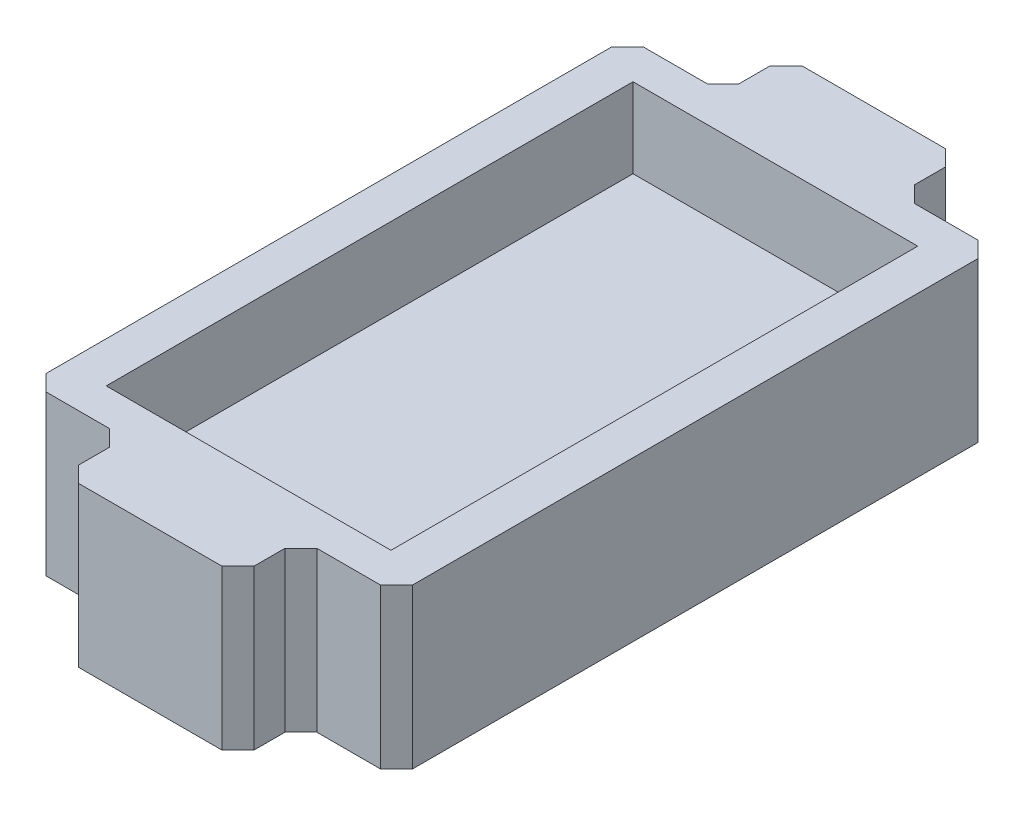
ISO-10303-21;
HEADER;
FILE_DESCRIPTION(('STEP AP214'),'2;1');
FILE_NAME('part.step','',(''),(''),'','','');
FILE_SCHEMA(('AUTOMOTIVE_DESIGN { 1 0 10303 214 1 1 1 1 }'));
ENDSEC;
DATA;
#1=APPLICATION_CONTEXT('core data for automotive mechanical design processes');
#2=APPLICATION_PROTOCOL_DEFINITION('international standard','automotive_design',2000,#1);
#3=PRODUCT_CONTEXT('',#1,'mechanical');
#4=PRODUCT('Part','Part','',(#3));
#5=PRODUCT_RELATED_PRODUCT_CATEGORY('part','',(#4));
#6=PRODUCT_DEFINITION_FORMATION('','',#4);
#7=PRODUCT_DEFINITION_CONTEXT('part definition',#1,'design');
#8=PRODUCT_DEFINITION('design','',#6,#7);
#9=PRODUCT_DEFINITION_SHAPE('','',#8);
#10=(LENGTH_UNIT() NAMED_UNIT(*) SI_UNIT(.MILLI.,.METRE.));
#11=(NAMED_UNIT(*) PLANE_ANGLE_UNIT() SI_UNIT($,.RADIAN.));
#12=(NAMED_UNIT(*) SI_UNIT($,.STERADIAN.) SOLID_ANGLE_UNIT());
#13=UNCERTAINTY_MEASURE_WITH_UNIT(LENGTH_MEASURE(1.E-05),#10,'distance_accuracy_value','');
#14=(GEOMETRIC_REPRESENTATION_CONTEXT(3) GLOBAL_UNCERTAINTY_ASSIGNED_CONTEXT((#13)) GLOBAL_UNIT_ASSIGNED_CONTEXT((#10,
#11,#12)) REPRESENTATION_CONTEXT('',''));
#15=CARTESIAN_POINT('',(0.,0.,0.));
#16=DIRECTION('',(0.,0.,1.));
#17=DIRECTION('',(1.,0.,0.));
#18=AXIS2_PLACEMENT_3D('',#15,#16,#17);
#19=CARTESIAN_POINT('',(0.,10.,0.));
#20=DIRECTION('',(0.,1.,0.));
#21=DIRECTION('',(0.,0.,1.));
#22=AXIS2_PLACEMENT_3D('',#19,#20,#21);
#23=PLANE('',#22);
#24=DIRECTION('',(1.,0.,0.));
#25=VECTOR('',#24,1.);
#26=CARTESIAN_POINT('',(0.,10.,0.));
#27=LINE('',#26,#25);
#28=CARTESIAN_POINT('',(18.,10.,0.));
#29=VERTEX_POINT('',#28);
#30=CARTESIAN_POINT('',(22.,10.,0.));
#31=VERTEX_POINT('',#30);
#32=EDGE_CURVE('E267',#29,#31,#27,.T.);
#33=ORIENTED_EDGE('',*,*,#32,.T.);
#34=DIRECTION('',(-0.707106781186548,0.,0.707106781186548));
#35=VECTOR('',#34,1.);
#36=CARTESIAN_POINT('',(11.,10.,11.));
#37=LINE('',#36,#35);
#38=CARTESIAN_POINT('',(23.,10.,-1.));
#39=VERTEX_POINT('',#38);
#40=EDGE_CURVE('E361',#31,#39,#37,.F.);
#41=ORIENTED_EDGE('',*,*,#40,.T.);
#42=DIRECTION('',(0.,0.,-1.));
#43=VECTOR('',#42,1.);
#44=CARTESIAN_POINT('',(23.,10.,0.));
#45=LINE('',#44,#43);
#46=CARTESIAN_POINT('',(23.,10.,-36.5));
#47=VERTEX_POINT('',#46);
#48=EDGE_CURVE('E272',#39,#47,#45,.T.);
#49=ORIENTED_EDGE('',*,*,#48,.T.);
#50=DIRECTION('',(0.70710678118655,0.,0.707106781186545));
#51=VECTOR('',#50,1.);
#52=CARTESIAN_POINT('',(29.7499999999999,10.,-29.7500000000001));
#53=LINE('',#52,#51);
#54=CARTESIAN_POINT('',(22.,10.,-37.5));
#55=VERTEX_POINT('',#54);
#56=EDGE_CURVE('E347',#47,#55,#53,.F.);
#57=ORIENTED_EDGE('',*,*,#56,.T.);
#58=DIRECTION('',(-1.,0.,0.));
#59=VECTOR('',#58,1.);
#60=CARTESIAN_POINT('',(0.,10.,-37.5));
#61=LINE('',#60,#59);
#62=CARTESIAN_POINT('',(18.,10.,-37.5));
#63=VERTEX_POINT('',#62);
#64=EDGE_CURVE('E275',#55,#63,#61,.T.);
#65=ORIENTED_EDGE('',*,*,#64,.T.);
#66=DIRECTION('',(-0.707106781186545,0.,-0.70710678118655));
#67=VECTOR('',#66,1.);
#68=CARTESIAN_POINT('',(17.,10.,-38.5));
#69=LINE('',#68,#67);
#70=CARTESIAN_POINT('',(17.,10.,-38.5));
#71=VERTEX_POINT('',#70);
#72=EDGE_CURVE('E11',#63,#71,#69,.T.);
#73=ORIENTED_EDGE('',*,*,#72,.T.);
#74=DIRECTION('',(0.,0.,1.));
#75=VECTOR('',#74,1.);
#76=CARTESIAN_POINT('',(17.,10.,0.));
#77=LINE('',#76,#75);
#78=CARTESIAN_POINT('',(17.,10.,-40.45));
#79=VERTEX_POINT('',#78);
#80=EDGE_CURVE('E280',#79,#71,#77,.T.);
#81=ORIENTED_EDGE('',*,*,#80,.F.);
#82=DIRECTION('',(0.70710678118655,0.,0.707106781186545));
#83=VECTOR('',#82,1.);
#84=CARTESIAN_POINT('',(28.7249999999999,10.,-28.7250000000001));
#85=LINE('',#84,#83);
#86=CARTESIAN_POINT('',(16.,10.,-41.45));
#87=VERTEX_POINT('',#86);
#88=EDGE_CURVE('E349',#79,#87,#85,.F.);
#89=ORIENTED_EDGE('',*,*,#88,.T.);
#90=DIRECTION('',(1.,0.,0.));
#91=VECTOR('',#90,1.);
#92=CARTESIAN_POINT('',(0.,10.,-41.45));
#93=LINE('',#92,#91);
#94=CARTESIAN_POINT('',(7.00000000000001,10.,-41.45));
#95=VERTEX_POINT('',#94);
#96=EDGE_CURVE('E283',#95,#87,#93,.T.);
#97=ORIENTED_EDGE('',*,*,#96,.F.);
#98=DIRECTION('',(-0.707106781186548,0.,0.707106781186548));
#99=VECTOR('',#98,1.);
#100=CARTESIAN_POINT('',(-17.225,10.,-17.225));
#101=LINE('',#100,#99);
#102=CARTESIAN_POINT('',(6.,10.,-40.45));
#103=VERTEX_POINT('',#102);
#104=EDGE_CURVE('E351',#95,#103,#101,.T.);
#105=ORIENTED_EDGE('',*,*,#104,.T.);
#106=DIRECTION('',(0.,0.,1.));
#107=VECTOR('',#106,1.);
#108=CARTESIAN_POINT('',(5.99999999999999,10.,0.));
#109=LINE('',#108,#107);
#110=CARTESIAN_POINT('',(6.,10.,-38.5));
#111=VERTEX_POINT('',#110);
#112=EDGE_CURVE('E279',#103,#111,#109,.T.);
#113=ORIENTED_EDGE('',*,*,#112,.T.);
#114=DIRECTION('',(0.707106781186545,0.,-0.70710678118655));
#115=VECTOR('',#114,1.);
#116=CARTESIAN_POINT('',(5.00000000000002,10.,-37.5));
#117=LINE('',#116,#115);
#118=CARTESIAN_POINT('',(5.00000000000002,10.,-37.5));
#119=VERTEX_POINT('',#118);
#120=EDGE_CURVE('E422',#111,#119,#117,.F.);
#121=ORIENTED_EDGE('',*,*,#120,.T.);
#122=CARTESIAN_POINT('',(1.00000000000001,10.,-37.5));
#123=VERTEX_POINT('',#122);
#124=EDGE_CURVE('E276',#119,#123,#61,.T.);
#125=ORIENTED_EDGE('',*,*,#124,.T.);
#126=DIRECTION('',(0.707106781186548,0.,-0.707106781186548));
#127=VECTOR('',#126,1.);
#128=CARTESIAN_POINT('',(-18.25,10.,-18.25));
#129=LINE('',#128,#127);
#130=CARTESIAN_POINT('',(0.,10.,-36.5));
#131=VERTEX_POINT('',#130);
#132=EDGE_CURVE('E353',#123,#131,#129,.F.);
#133=ORIENTED_EDGE('',*,*,#132,.T.);
#134=DIRECTION('',(0.,0.,1.));
#135=VECTOR('',#134,1.);
#136=CARTESIAN_POINT('',(0.,10.,0.));
#137=LINE('',#136,#135);
#138=CARTESIAN_POINT('',(0.,10.,-1.00000000000001));
#139=VERTEX_POINT('',#138);
#140=EDGE_CURVE('E271',#131,#139,#137,.T.);
#141=ORIENTED_EDGE('',*,*,#140,.T.);
#142=DIRECTION('',(-0.707106781186548,0.,-0.707106781186548));
#143=VECTOR('',#142,1.);
#144=CARTESIAN_POINT('',(0.500000000000004,10.,-0.500000000000004));
#145=LINE('',#144,#143);
#146=CARTESIAN_POINT('',(1.00000000000001,10.,0.));
#147=VERTEX_POINT('',#146);
#148=EDGE_CURVE('E355',#139,#147,#145,.F.);
#149=ORIENTED_EDGE('',*,*,#148,.T.);
#150=CARTESIAN_POINT('',(5.00000000000001,10.,0.));
#151=VERTEX_POINT('',#150);
#152=EDGE_CURVE('E268',#147,#151,#27,.T.);
#153=ORIENTED_EDGE('',*,*,#152,.T.);
#154=DIRECTION('',(0.707106781186548,0.,0.707106781186548));
#155=VECTOR('',#154,1.);
#156=CARTESIAN_POINT('',(6.,10.,0.999999999999994));
#157=LINE('',#156,#155);
#158=CARTESIAN_POINT('',(6.,10.,0.999999999999994));
#159=VERTEX_POINT('',#158);
#160=EDGE_CURVE('E58',#151,#159,#157,.T.);
#161=ORIENTED_EDGE('',*,*,#160,.T.);
#162=DIRECTION('',(0.,0.,-1.));
#163=VECTOR('',#162,1.);
#164=CARTESIAN_POINT('',(6.,10.,0.));
#165=LINE('',#164,#163);
#166=CARTESIAN_POINT('',(6.,10.,2.95));
#167=VERTEX_POINT('',#166);
#168=EDGE_CURVE('E270',#167,#159,#165,.T.);
#169=ORIENTED_EDGE('',*,*,#168,.F.);
#170=DIRECTION('',(-0.707106781186548,0.,-0.707106781186548));
#171=VECTOR('',#170,1.);
#172=CARTESIAN_POINT('',(1.525,10.,-1.525));
#173=LINE('',#172,#171);
#174=CARTESIAN_POINT('',(7.00000000000001,10.,3.95));
#175=VERTEX_POINT('',#174);
#176=EDGE_CURVE('E357',#167,#175,#173,.F.);
#177=ORIENTED_EDGE('',*,*,#176,.T.);
#178=DIRECTION('',(-1.,0.,0.));
#179=VECTOR('',#178,1.);
#180=CARTESIAN_POINT('',(0.,10.,3.95));
#181=LINE('',#180,#179);
#182=CARTESIAN_POINT('',(16.,10.,3.95));
#183=VERTEX_POINT('',#182);
#184=EDGE_CURVE('E260',#183,#175,#181,.T.);
#185=ORIENTED_EDGE('',*,*,#184,.F.);
#186=DIRECTION('',(0.707106781186548,0.,-0.707106781186548));
#187=VECTOR('',#186,1.);
#188=CARTESIAN_POINT('',(9.975,10.,9.975));
#189=LINE('',#188,#187);
#190=CARTESIAN_POINT('',(17.,10.,2.95));
#191=VERTEX_POINT('',#190);
#192=EDGE_CURVE('E359',#183,#191,#189,.T.);
#193=ORIENTED_EDGE('',*,*,#192,.T.);
#194=DIRECTION('',(0.,0.,-1.));
#195=VECTOR('',#194,1.);
#196=CARTESIAN_POINT('',(17.,10.,0.));
#197=LINE('',#196,#195);
#198=CARTESIAN_POINT('',(17.,10.,1.));
#199=VERTEX_POINT('',#198);
#200=EDGE_CURVE('E263',#191,#199,#197,.T.);
#201=ORIENTED_EDGE('',*,*,#200,.T.);
#202=DIRECTION('',(-0.707106781186548,0.,0.707106781186548));
#203=VECTOR('',#202,1.);
#204=CARTESIAN_POINT('',(18.,10.,0.));
#205=LINE('',#204,#203);
#206=EDGE_CURVE('E415',#199,#29,#205,.F.);
#207=ORIENTED_EDGE('',*,*,#206,.T.);
#208=EDGE_LOOP('',(#33,#41,#49,#57,#65,#73,#81,#89,#97,#105,#113,#121,#125,#133,#141,#149,#153,
#161,#169,#177,#185,#193,#201,#207));
#209=FACE_BOUND('',#208,.T.);
#210=DIRECTION('',(-1.,0.,0.));
#211=VECTOR('',#210,1.);
#212=CARTESIAN_POINT('',(0.,10.,-2.21657493361818));
#213=LINE('',#212,#211);
#214=CARTESIAN_POINT('',(20.4368914595786,10.,-2.21657493361818));
#215=VERTEX_POINT('',#214);
#216=CARTESIAN_POINT('',(2.56310854042141,10.,-2.21657493361818));
#217=VERTEX_POINT('',#216);
#218=EDGE_CURVE('E250',#215,#217,#213,.T.);
#219=ORIENTED_EDGE('',*,*,#218,.T.);
#220=DIRECTION('',(0.,0.,-1.));
#221=VECTOR('',#220,1.);
#222=CARTESIAN_POINT('',(2.56310854042141,10.,0.));
#223=LINE('',#222,#221);
#224=CARTESIAN_POINT('',(2.56310854042141,10.,-35.2834250663818));
#225=VERTEX_POINT('',#224);
#226=EDGE_CURVE('E50',#217,#225,#223,.T.);
#227=ORIENTED_EDGE('',*,*,#226,.T.);
#228=DIRECTION('',(-1.,0.,0.));
#229=VECTOR('',#228,1.);
#230=CARTESIAN_POINT('',(0.,10.,-35.2834250663818));
#231=LINE('',#230,#229);
#232=CARTESIAN_POINT('',(20.4368914595786,10.,-35.2834250663818));
#233=VERTEX_POINT('',#232);
#234=EDGE_CURVE('E241',#233,#225,#231,.T.);
#235=ORIENTED_EDGE('',*,*,#234,.F.);
#236=DIRECTION('',(0.,0.,-1.));
#237=VECTOR('',#236,1.);
#238=CARTESIAN_POINT('',(20.4368914595786,10.,0.));
#239=LINE('',#238,#237);
#240=EDGE_CURVE('E244',#215,#233,#239,.T.);
#241=ORIENTED_EDGE('',*,*,#240,.F.);
#242=EDGE_LOOP('',(#219,#227,#235,#241));
#243=FACE_BOUND('',#242,.T.);
#244=ADVANCED_FACE('F35',(#209,#243),#23,.T.);
#245=CARTESIAN_POINT('',(0.,10.,3.95));
#246=DIRECTION('',(0.,0.,1.));
#247=DIRECTION('',(1.,0.,0.));
#248=AXIS2_PLACEMENT_3D('',#245,#246,#247);
#249=PLANE('',#248);
#250=DIRECTION('',(-1.,0.,0.));
#251=VECTOR('',#250,1.);
#252=CARTESIAN_POINT('',(0.,0.,3.95));
#253=LINE('',#252,#251);
#254=CARTESIAN_POINT('',(16.,0.,3.95));
#255=VERTEX_POINT('',#254);
#256=CARTESIAN_POINT('',(7.00000000000001,0.,3.95));
#257=VERTEX_POINT('',#256);
#258=EDGE_CURVE('E256',#255,#257,#253,.T.);
#259=ORIENTED_EDGE('',*,*,#258,.F.);
#260=DIRECTION('',(0.,1.,0.));
#261=VECTOR('',#260,1.);
#262=CARTESIAN_POINT('',(16.,10.,3.95));
#263=LINE('',#262,#261);
#264=EDGE_CURVE('E371',#255,#183,#263,.T.);
#265=ORIENTED_EDGE('',*,*,#264,.T.);
#266=ORIENTED_EDGE('',*,*,#184,.T.);
#267=DIRECTION('',(0.,-1.,0.));
#268=VECTOR('',#267,1.);
#269=CARTESIAN_POINT('',(7.00000000000001,10.,3.95));
#270=LINE('',#269,#268);
#271=EDGE_CURVE('E368',#175,#257,#270,.T.);
#272=ORIENTED_EDGE('',*,*,#271,.T.);
#273=EDGE_LOOP('',(#259,#265,#266,#272));
#274=FACE_BOUND('',#273,.T.);
#275=ADVANCED_FACE('F503',(#274),#249,.T.);
#276=CARTESIAN_POINT('',(17.,10.,0.));
#277=DIRECTION('',(-1.,0.,0.));
#278=DIRECTION('',(0.,0.,1.));
#279=AXIS2_PLACEMENT_3D('',#276,#277,#278);
#280=PLANE('',#279);
#281=DIRECTION('',(0.,0.,-1.));
#282=VECTOR('',#281,1.);
#283=CARTESIAN_POINT('',(17.,0.,0.));
#284=LINE('',#283,#282);
#285=CARTESIAN_POINT('',(17.,0.,2.95000000000001));
#286=VERTEX_POINT('',#285);
#287=CARTESIAN_POINT('',(17.,0.,1.));
#288=VERTEX_POINT('',#287);
#289=EDGE_CURVE('E294',#286,#288,#284,.T.);
#290=ORIENTED_EDGE('',*,*,#289,.T.);
#291=DIRECTION('',(0.,1.,0.));
#292=VECTOR('',#291,1.);
#293=CARTESIAN_POINT('',(17.,10.,1.));
#294=LINE('',#293,#292);
#295=EDGE_CURVE('E366',#288,#199,#294,.T.);
#296=ORIENTED_EDGE('',*,*,#295,.T.);
#297=ORIENTED_EDGE('',*,*,#200,.F.);
#298=DIRECTION('',(0.,-1.,0.));
#299=VECTOR('',#298,1.);
#300=CARTESIAN_POINT('',(17.,0.,2.95000000000001));
#301=LINE('',#300,#299);
#302=EDGE_CURVE('E363',#191,#286,#301,.T.);
#303=ORIENTED_EDGE('',*,*,#302,.T.);
#304=EDGE_LOOP('',(#290,#296,#297,#303));
#305=FACE_BOUND('',#304,.T.);
#306=ADVANCED_FACE('F513',(#305),#280,.F.);
#307=CARTESIAN_POINT('',(0.,10.,0.));
#308=DIRECTION('',(0.,0.,-1.));
#309=DIRECTION('',(-1.,0.,0.));
#310=AXIS2_PLACEMENT_3D('',#307,#308,#309);
#311=PLANE('',#310);
#312=DIRECTION('',(1.,0.,0.));
#313=VECTOR('',#312,1.);
#314=CARTESIAN_POINT('',(0.,0.,0.));
#315=LINE('',#314,#313);
#316=CARTESIAN_POINT('',(18.,0.,0.));
#317=VERTEX_POINT('',#316);
#318=CARTESIAN_POINT('',(22.,0.,0.));
#319=VERTEX_POINT('',#318);
#320=EDGE_CURVE('E297',#317,#319,#315,.T.);
#321=ORIENTED_EDGE('',*,*,#320,.T.);
#322=DIRECTION('',(0.,1.,0.));
#323=VECTOR('',#322,1.);
#324=CARTESIAN_POINT('',(22.,10.,0.));
#325=LINE('',#324,#323);
#326=EDGE_CURVE('E345',#319,#31,#325,.T.);
#327=ORIENTED_EDGE('',*,*,#326,.T.);
#328=ORIENTED_EDGE('',*,*,#32,.F.);
#329=DIRECTION('',(0.,-1.,0.));
#330=VECTOR('',#329,1.);
#331=CARTESIAN_POINT('',(18.,0.,0.));
#332=LINE('',#331,#330);
#333=EDGE_CURVE('E342',#29,#317,#332,.T.);
#334=ORIENTED_EDGE('',*,*,#333,.T.);
#335=EDGE_LOOP('',(#321,#327,#328,#334));
#336=FACE_BOUND('',#335,.T.);
#337=ADVANCED_FACE('F522',(#336),#311,.F.);
#338=CARTESIAN_POINT('',(23.,10.,0.));
#339=DIRECTION('',(-1.,0.,0.));
#340=DIRECTION('',(0.,0.,1.));
#341=AXIS2_PLACEMENT_3D('',#338,#339,#340);
#342=PLANE('',#341);
#343=ORIENTED_EDGE('',*,*,#48,.F.);
#344=DIRECTION('',(0.,-1.,0.));
#345=VECTOR('',#344,1.);
#346=CARTESIAN_POINT('',(23.,10.,-1.));
#347=LINE('',#346,#345);
#348=CARTESIAN_POINT('',(23.,0.,-1.));
#349=VERTEX_POINT('',#348);
#350=EDGE_CURVE('E323',#39,#349,#347,.T.);
#351=ORIENTED_EDGE('',*,*,#350,.T.);
#352=DIRECTION('',(0.,0.,-1.));
#353=VECTOR('',#352,1.);
#354=CARTESIAN_POINT('',(23.,0.,0.));
#355=LINE('',#354,#353);
#356=CARTESIAN_POINT('',(23.,0.,-36.5));
#357=VERTEX_POINT('',#356);
#358=EDGE_CURVE('E300',#349,#357,#355,.T.);
#359=ORIENTED_EDGE('',*,*,#358,.T.);
#360=DIRECTION('',(0.,1.,0.));
#361=VECTOR('',#360,1.);
#362=CARTESIAN_POINT('',(23.,10.,-36.5));
#363=LINE('',#362,#361);
#364=EDGE_CURVE('E291',#357,#47,#363,.T.);
#365=ORIENTED_EDGE('',*,*,#364,.T.);
#366=EDGE_LOOP('',(#343,#351,#359,#365));
#367=FACE_BOUND('',#366,.T.);
#368=ADVANCED_FACE('F530',(#367),#342,.F.);
#369=CARTESIAN_POINT('',(0.,10.,-37.5));
#370=DIRECTION('',(0.,0.,1.));
#371=DIRECTION('',(1.,0.,0.));
#372=AXIS2_PLACEMENT_3D('',#369,#370,#371);
#373=PLANE('',#372);
#374=ORIENTED_EDGE('',*,*,#64,.F.);
#375=DIRECTION('',(0.,-1.,0.));
#376=VECTOR('',#375,1.);
#377=CARTESIAN_POINT('',(22.,10.,-37.5));
#378=LINE('',#377,#376);
#379=CARTESIAN_POINT('',(22.,0.,-37.5));
#380=VERTEX_POINT('',#379);
#381=EDGE_CURVE('E410',#55,#380,#378,.T.);
#382=ORIENTED_EDGE('',*,*,#381,.T.);
#383=DIRECTION('',(-1.,0.,0.));
#384=VECTOR('',#383,1.);
#385=CARTESIAN_POINT('',(0.,0.,-37.5));
#386=LINE('',#385,#384);
#387=CARTESIAN_POINT('',(18.,0.,-37.5));
#388=VERTEX_POINT('',#387);
#389=EDGE_CURVE('E304',#380,#388,#386,.T.);
#390=ORIENTED_EDGE('',*,*,#389,.T.);
#391=DIRECTION('',(0.,1.,0.));
#392=VECTOR('',#391,1.);
#393=CARTESIAN_POINT('',(18.,10.,-37.5));
#394=LINE('',#393,#392);
#395=EDGE_CURVE('E408',#388,#63,#394,.T.);
#396=ORIENTED_EDGE('',*,*,#395,.T.);
#397=EDGE_LOOP('',(#374,#382,#390,#396));
#398=FACE_BOUND('',#397,.T.);
#399=ADVANCED_FACE('F433',(#398),#373,.F.);
#400=CARTESIAN_POINT('',(17.,10.,0.));
#401=DIRECTION('',(1.,0.,0.));
#402=DIRECTION('',(0.,0.,-1.));
#403=AXIS2_PLACEMENT_3D('',#400,#401,#402);
#404=PLANE('',#403);
#405=DIRECTION('',(0.,0.,1.));
#406=VECTOR('',#405,1.);
#407=CARTESIAN_POINT('',(17.,0.,0.));
#408=LINE('',#407,#406);
#409=CARTESIAN_POINT('',(17.,0.,-40.45));
#410=VERTEX_POINT('',#409);
#411=CARTESIAN_POINT('',(17.,0.,-38.5));
#412=VERTEX_POINT('',#411);
#413=EDGE_CURVE('E307',#410,#412,#408,.T.);
#414=ORIENTED_EDGE('',*,*,#413,.F.);
#415=DIRECTION('',(0.,1.,0.));
#416=VECTOR('',#415,1.);
#417=CARTESIAN_POINT('',(17.,10.,-40.45));
#418=LINE('',#417,#416);
#419=EDGE_CURVE('E406',#410,#79,#418,.T.);
#420=ORIENTED_EDGE('',*,*,#419,.T.);
#421=ORIENTED_EDGE('',*,*,#80,.T.);
#422=DIRECTION('',(0.,-1.,0.));
#423=VECTOR('',#422,1.);
#424=CARTESIAN_POINT('',(17.,10.,-38.5));
#425=LINE('',#424,#423);
#426=EDGE_CURVE('E403',#71,#412,#425,.T.);
#427=ORIENTED_EDGE('',*,*,#426,.T.);
#428=EDGE_LOOP('',(#414,#420,#421,#427));
#429=FACE_BOUND('',#428,.T.);
#430=ADVANCED_FACE('F442',(#429),#404,.T.);
#431=CARTESIAN_POINT('',(0.,10.,-41.45));
#432=DIRECTION('',(0.,0.,-1.));
#433=DIRECTION('',(-1.,0.,0.));
#434=AXIS2_PLACEMENT_3D('',#431,#432,#433);
#435=PLANE('',#434);
#436=DIRECTION('',(1.,0.,0.));
#437=VECTOR('',#436,1.);
#438=CARTESIAN_POINT('',(0.,0.,-41.45));
#439=LINE('',#438,#437);
#440=CARTESIAN_POINT('',(7.00000000000001,0.,-41.45));
#441=VERTEX_POINT('',#440);
#442=CARTESIAN_POINT('',(16.,0.,-41.45));
#443=VERTEX_POINT('',#442);
#444=EDGE_CURVE('E311',#441,#443,#439,.T.);
#445=ORIENTED_EDGE('',*,*,#444,.F.);
#446=DIRECTION('',(0.,1.,0.));
#447=VECTOR('',#446,1.);
#448=CARTESIAN_POINT('',(7.00000000000001,10.,-41.45));
#449=LINE('',#448,#447);
#450=EDGE_CURVE('E401',#441,#95,#449,.T.);
#451=ORIENTED_EDGE('',*,*,#450,.T.);
#452=ORIENTED_EDGE('',*,*,#96,.T.);
#453=DIRECTION('',(0.,-1.,0.));
#454=VECTOR('',#453,1.);
#455=CARTESIAN_POINT('',(16.,10.,-41.45));
#456=LINE('',#455,#454);
#457=EDGE_CURVE('E398',#87,#443,#456,.T.);
#458=ORIENTED_EDGE('',*,*,#457,.T.);
#459=EDGE_LOOP('',(#445,#451,#452,#458));
#460=FACE_BOUND('',#459,.T.);
#461=ADVANCED_FACE('F451',(#460),#435,.T.);
#462=CARTESIAN_POINT('',(5.99999999999999,10.,0.));
#463=DIRECTION('',(1.,0.,0.));
#464=DIRECTION('',(0.,0.,-1.));
#465=AXIS2_PLACEMENT_3D('',#462,#463,#464);
#466=PLANE('',#465);
#467=DIRECTION('',(0.,0.,1.));
#468=VECTOR('',#467,1.);
#469=CARTESIAN_POINT('',(5.99999999999999,0.,0.));
#470=LINE('',#469,#468);
#471=CARTESIAN_POINT('',(6.,0.,-40.45));
#472=VERTEX_POINT('',#471);
#473=CARTESIAN_POINT('',(6.,0.,-38.5));
#474=VERTEX_POINT('',#473);
#475=EDGE_CURVE('E314',#472,#474,#470,.T.);
#476=ORIENTED_EDGE('',*,*,#475,.T.);
#477=DIRECTION('',(0.,1.,0.));
#478=VECTOR('',#477,1.);
#479=CARTESIAN_POINT('',(6.,10.,-38.5));
#480=LINE('',#479,#478);
#481=EDGE_CURVE('E396',#474,#111,#480,.T.);
#482=ORIENTED_EDGE('',*,*,#481,.T.);
#483=ORIENTED_EDGE('',*,*,#112,.F.);
#484=DIRECTION('',(0.,-1.,0.));
#485=VECTOR('',#484,1.);
#486=CARTESIAN_POINT('',(6.,0.,-40.45));
#487=LINE('',#486,#485);
#488=EDGE_CURVE('E393',#103,#472,#487,.T.);
#489=ORIENTED_EDGE('',*,*,#488,.T.);
#490=EDGE_LOOP('',(#476,#482,#483,#489));
#491=FACE_BOUND('',#490,.T.);
#492=ADVANCED_FACE('F459',(#491),#466,.F.);
#493=CARTESIAN_POINT('',(5.00000000000002,0.,-37.5));
#494=VERTEX_POINT('',#493);
#495=CARTESIAN_POINT('',(1.00000000000001,0.,-37.5));
#496=VERTEX_POINT('',#495);
#497=EDGE_CURVE('E308',#494,#496,#386,.T.);
#498=ORIENTED_EDGE('',*,*,#497,.T.);
#499=DIRECTION('',(0.,1.,0.));
#500=VECTOR('',#499,1.);
#501=CARTESIAN_POINT('',(1.00000000000001,10.,-37.5));
#502=LINE('',#501,#500);
#503=EDGE_CURVE('E391',#496,#123,#502,.T.);
#504=ORIENTED_EDGE('',*,*,#503,.T.);
#505=ORIENTED_EDGE('',*,*,#124,.F.);
#506=DIRECTION('',(0.,-1.,0.));
#507=VECTOR('',#506,1.);
#508=CARTESIAN_POINT('',(5.00000000000002,0.,-37.5));
#509=LINE('',#508,#507);
#510=EDGE_CURVE('E388',#119,#494,#509,.T.);
#511=ORIENTED_EDGE('',*,*,#510,.T.);
#512=EDGE_LOOP('',(#498,#504,#505,#511));
#513=FACE_BOUND('',#512,.T.);
#514=ADVANCED_FACE('F469',(#513),#373,.F.);
#515=CARTESIAN_POINT('',(0.,10.,0.));
#516=DIRECTION('',(1.,0.,0.));
#517=DIRECTION('',(0.,0.,-1.));
#518=AXIS2_PLACEMENT_3D('',#515,#516,#517);
#519=PLANE('',#518);
#520=DIRECTION('',(0.,0.,1.));
#521=VECTOR('',#520,1.);
#522=CARTESIAN_POINT('',(0.,0.,0.));
#523=LINE('',#522,#521);
#524=CARTESIAN_POINT('',(0.,0.,-36.5));
#525=VERTEX_POINT('',#524);
#526=CARTESIAN_POINT('',(0.,0.,-1.00000000000001));
#527=VERTEX_POINT('',#526);
#528=EDGE_CURVE('E317',#525,#527,#523,.T.);
#529=ORIENTED_EDGE('',*,*,#528,.T.);
#530=DIRECTION('',(0.,1.,0.));
#531=VECTOR('',#530,1.);
#532=CARTESIAN_POINT('',(0.,10.,-1.00000000000001));
#533=LINE('',#532,#531);
#534=EDGE_CURVE('E386',#527,#139,#533,.T.);
#535=ORIENTED_EDGE('',*,*,#534,.T.);
#536=ORIENTED_EDGE('',*,*,#140,.F.);
#537=DIRECTION('',(0.,-1.,0.));
#538=VECTOR('',#537,1.);
#539=CARTESIAN_POINT('',(0.,10.,-36.5));
#540=LINE('',#539,#538);
#541=EDGE_CURVE('E383',#131,#525,#540,.T.);
#542=ORIENTED_EDGE('',*,*,#541,.T.);
#543=EDGE_LOOP('',(#529,#535,#536,#542));
#544=FACE_BOUND('',#543,.T.);
#545=ADVANCED_FACE('F478',(#544),#519,.F.);
#546=CARTESIAN_POINT('',(1.00000000000001,0.,0.));
#547=VERTEX_POINT('',#546);
#548=CARTESIAN_POINT('',(5.00000000000001,0.,0.));
#549=VERTEX_POINT('',#548);
#550=EDGE_CURVE('E301',#547,#549,#315,.T.);
#551=ORIENTED_EDGE('',*,*,#550,.T.);
#552=DIRECTION('',(0.,1.,0.));
#553=VECTOR('',#552,1.);
#554=CARTESIAN_POINT('',(5.00000000000001,10.,0.));
#555=LINE('',#554,#553);
#556=EDGE_CURVE('E381',#549,#151,#555,.T.);
#557=ORIENTED_EDGE('',*,*,#556,.T.);
#558=ORIENTED_EDGE('',*,*,#152,.F.);
#559=DIRECTION('',(0.,-1.,0.));
#560=VECTOR('',#559,1.);
#561=CARTESIAN_POINT('',(1.00000000000001,10.,0.));
#562=LINE('',#561,#560);
#563=EDGE_CURVE('E378',#147,#547,#562,.T.);
#564=ORIENTED_EDGE('',*,*,#563,.T.);
#565=EDGE_LOOP('',(#551,#557,#558,#564));
#566=FACE_BOUND('',#565,.T.);
#567=ADVANCED_FACE('F487',(#566),#311,.F.);
#568=CARTESIAN_POINT('',(6.,10.,0.));
#569=DIRECTION('',(-1.,0.,0.));
#570=DIRECTION('',(0.,0.,1.));
#571=AXIS2_PLACEMENT_3D('',#568,#569,#570);
#572=PLANE('',#571);
#573=DIRECTION('',(0.,0.,-1.));
#574=VECTOR('',#573,1.);
#575=CARTESIAN_POINT('',(6.,0.,0.));
#576=LINE('',#575,#574);
#577=CARTESIAN_POINT('',(6.,0.,2.94999999999999));
#578=VERTEX_POINT('',#577);
#579=CARTESIAN_POINT('',(6.,0.,0.999999999999994));
#580=VERTEX_POINT('',#579);
#581=EDGE_CURVE('E264',#578,#580,#576,.T.);
#582=ORIENTED_EDGE('',*,*,#581,.F.);
#583=DIRECTION('',(0.,1.,0.));
#584=VECTOR('',#583,1.);
#585=CARTESIAN_POINT('',(6.,10.,2.94999999999999));
#586=LINE('',#585,#584);
#587=EDGE_CURVE('E376',#578,#167,#586,.T.);
#588=ORIENTED_EDGE('',*,*,#587,.T.);
#589=ORIENTED_EDGE('',*,*,#168,.T.);
#590=DIRECTION('',(0.,-1.,0.));
#591=VECTOR('',#590,1.);
#592=CARTESIAN_POINT('',(6.,10.,0.999999999999994));
#593=LINE('',#592,#591);
#594=EDGE_CURVE('E373',#159,#580,#593,.T.);
#595=ORIENTED_EDGE('',*,*,#594,.T.);
#596=EDGE_LOOP('',(#582,#588,#589,#595));
#597=FACE_BOUND('',#596,.T.);
#598=ADVANCED_FACE('F495',(#597),#572,.T.);
#599=CARTESIAN_POINT('',(0.,0.,0.));
#600=DIRECTION('',(0.,1.,0.));
#601=DIRECTION('',(0.,0.,1.));
#602=AXIS2_PLACEMENT_3D('',#599,#600,#601);
#603=PLANE('',#602);
#604=ORIENTED_EDGE('',*,*,#358,.F.);
#605=DIRECTION('',(0.707106781186548,0.,-0.707106781186548));
#606=VECTOR('',#605,1.);
#607=CARTESIAN_POINT('',(23.,0.,-1.));
#608=LINE('',#607,#606);
#609=EDGE_CURVE('E340',#349,#319,#608,.F.);
#610=ORIENTED_EDGE('',*,*,#609,.T.);
#611=ORIENTED_EDGE('',*,*,#320,.F.);
#612=DIRECTION('',(0.707106781186548,0.,-0.707106781186548));
#613=VECTOR('',#612,1.);
#614=CARTESIAN_POINT('',(9.,0.,9.));
#615=LINE('',#614,#613);
#616=EDGE_CURVE('E413',#317,#288,#615,.F.);
#617=ORIENTED_EDGE('',*,*,#616,.T.);
#618=ORIENTED_EDGE('',*,*,#289,.F.);
#619=DIRECTION('',(-0.707106781186548,0.,0.707106781186548));
#620=VECTOR('',#619,1.);
#621=CARTESIAN_POINT('',(17.,0.,2.95000000000001));
#622=LINE('',#621,#620);
#623=EDGE_CURVE('E338',#286,#255,#622,.T.);
#624=ORIENTED_EDGE('',*,*,#623,.T.);
#625=ORIENTED_EDGE('',*,*,#258,.T.);
#626=DIRECTION('',(0.707106781186548,0.,0.707106781186548));
#627=VECTOR('',#626,1.);
#628=CARTESIAN_POINT('',(7.00000000000001,0.,3.95));
#629=LINE('',#628,#627);
#630=EDGE_CURVE('E336',#257,#578,#629,.F.);
#631=ORIENTED_EDGE('',*,*,#630,.T.);
#632=ORIENTED_EDGE('',*,*,#581,.T.);
#633=DIRECTION('',(-0.707106781186548,0.,-0.707106781186548));
#634=VECTOR('',#633,1.);
#635=CARTESIAN_POINT('',(2.5,0.,-2.5));
#636=LINE('',#635,#634);
#637=EDGE_CURVE('E417',#580,#549,#636,.T.);
#638=ORIENTED_EDGE('',*,*,#637,.T.);
#639=ORIENTED_EDGE('',*,*,#550,.F.);
#640=DIRECTION('',(0.707106781186548,0.,0.707106781186548));
#641=VECTOR('',#640,1.);
#642=CARTESIAN_POINT('',(1.00000000000001,0.,0.));
#643=LINE('',#642,#641);
#644=EDGE_CURVE('E334',#547,#527,#643,.F.);
#645=ORIENTED_EDGE('',*,*,#644,.T.);
#646=ORIENTED_EDGE('',*,*,#528,.F.);
#647=DIRECTION('',(-0.707106781186548,0.,0.707106781186548));
#648=VECTOR('',#647,1.);
#649=CARTESIAN_POINT('',(0.,0.,-36.5));
#650=LINE('',#649,#648);
#651=EDGE_CURVE('E332',#525,#496,#650,.F.);
#652=ORIENTED_EDGE('',*,*,#651,.T.);
#653=ORIENTED_EDGE('',*,*,#497,.F.);
#654=DIRECTION('',(-0.707106781186545,0.,0.70710678118655));
#655=VECTOR('',#654,1.);
#656=CARTESIAN_POINT('',(-16.25,0.,-16.2499999999999));
#657=LINE('',#656,#655);
#658=EDGE_CURVE('E420',#494,#474,#657,.F.);
#659=ORIENTED_EDGE('',*,*,#658,.T.);
#660=ORIENTED_EDGE('',*,*,#475,.F.);
#661=DIRECTION('',(0.707106781186548,0.,-0.707106781186548));
#662=VECTOR('',#661,1.);
#663=CARTESIAN_POINT('',(6.,0.,-40.45));
#664=LINE('',#663,#662);
#665=EDGE_CURVE('E330',#472,#441,#664,.T.);
#666=ORIENTED_EDGE('',*,*,#665,.T.);
#667=ORIENTED_EDGE('',*,*,#444,.T.);
#668=DIRECTION('',(-0.70710678118655,0.,-0.707106781186545));
#669=VECTOR('',#668,1.);
#670=CARTESIAN_POINT('',(16.,0.,-41.45));
#671=LINE('',#670,#669);
#672=EDGE_CURVE('E328',#443,#410,#671,.F.);
#673=ORIENTED_EDGE('',*,*,#672,.T.);
#674=ORIENTED_EDGE('',*,*,#413,.T.);
#675=DIRECTION('',(0.707106781186545,0.,0.70710678118655));
#676=VECTOR('',#675,1.);
#677=CARTESIAN_POINT('',(27.7500000000001,0.,-27.7499999999999));
#678=LINE('',#677,#676);
#679=EDGE_CURVE('E43',#412,#388,#678,.T.);
#680=ORIENTED_EDGE('',*,*,#679,.T.);
#681=ORIENTED_EDGE('',*,*,#389,.F.);
#682=DIRECTION('',(-0.70710678118655,0.,-0.707106781186545));
#683=VECTOR('',#682,1.);
#684=CARTESIAN_POINT('',(22.,0.,-37.5));
#685=LINE('',#684,#683);
#686=EDGE_CURVE('E326',#380,#357,#685,.F.);
#687=ORIENTED_EDGE('',*,*,#686,.T.);
#688=EDGE_LOOP('',(#604,#610,#611,#617,#618,#624,#625,#631,#632,#638,#639,#645,#646,#652,#653,
#659,#660,#666,#667,#673,#674,#680,#681,#687));
#689=FACE_BOUND('',#688,.T.);
#690=ADVANCED_FACE('F426',(#689),#603,.F.);
#691=CARTESIAN_POINT('',(23.,10.,-1.));
#692=DIRECTION('',(-0.707106781186547,0.,-0.707106781186547));
#693=DIRECTION('',(0.,-1.,0.));
#694=AXIS2_PLACEMENT_3D('',#691,#692,#693);
#695=PLANE('',#694);
#696=ORIENTED_EDGE('',*,*,#40,.F.);
#697=ORIENTED_EDGE('',*,*,#326,.F.);
#698=ORIENTED_EDGE('',*,*,#609,.F.);
#699=ORIENTED_EDGE('',*,*,#350,.F.);
#700=EDGE_LOOP('',(#696,#697,#698,#699));
#701=FACE_BOUND('',#700,.T.);
#702=ADVANCED_FACE('F528',(#701),#695,.F.);
#703=CARTESIAN_POINT('',(18.,10.,0.));
#704=DIRECTION('',(0.707106781186547,0.,0.707106781186547));
#705=DIRECTION('',(0.,1.,0.));
#706=AXIS2_PLACEMENT_3D('',#703,#704,#705);
#707=PLANE('',#706);
#708=ORIENTED_EDGE('',*,*,#206,.F.);
#709=ORIENTED_EDGE('',*,*,#295,.F.);
#710=ORIENTED_EDGE('',*,*,#616,.F.);
#711=ORIENTED_EDGE('',*,*,#333,.F.);
#712=EDGE_LOOP('',(#708,#709,#710,#711));
#713=FACE_BOUND('',#712,.T.);
#714=ADVANCED_FACE('F519',(#713),#707,.T.);
#715=CARTESIAN_POINT('',(17.,10.,2.95000000000001));
#716=DIRECTION('',(0.707106781186547,0.,0.707106781186547));
#717=DIRECTION('',(0.,1.,0.));
#718=AXIS2_PLACEMENT_3D('',#715,#716,#717);
#719=PLANE('',#718);
#720=ORIENTED_EDGE('',*,*,#192,.F.);
#721=ORIENTED_EDGE('',*,*,#264,.F.);
#722=ORIENTED_EDGE('',*,*,#623,.F.);
#723=ORIENTED_EDGE('',*,*,#302,.F.);
#724=EDGE_LOOP('',(#720,#721,#722,#723));
#725=FACE_BOUND('',#724,.T.);
#726=ADVANCED_FACE('F510',(#725),#719,.T.);
#727=CARTESIAN_POINT('',(7.00000000000001,10.,3.95));
#728=DIRECTION('',(0.707106781186547,0.,-0.707106781186547));
#729=DIRECTION('',(0.,-1.,0.));
#730=AXIS2_PLACEMENT_3D('',#727,#728,#729);
#731=PLANE('',#730);
#732=ORIENTED_EDGE('',*,*,#176,.F.);
#733=ORIENTED_EDGE('',*,*,#587,.F.);
#734=ORIENTED_EDGE('',*,*,#630,.F.);
#735=ORIENTED_EDGE('',*,*,#271,.F.);
#736=EDGE_LOOP('',(#732,#733,#734,#735));
#737=FACE_BOUND('',#736,.T.);
#738=ADVANCED_FACE('F501',(#737),#731,.F.);
#739=CARTESIAN_POINT('',(6.,10.,0.999999999999994));
#740=DIRECTION('',(0.707106781186547,0.,-0.707106781186547));
#741=DIRECTION('',(0.,-1.,0.));
#742=AXIS2_PLACEMENT_3D('',#739,#740,#741);
#743=PLANE('',#742);
#744=ORIENTED_EDGE('',*,*,#160,.F.);
#745=ORIENTED_EDGE('',*,*,#556,.F.);
#746=ORIENTED_EDGE('',*,*,#637,.F.);
#747=ORIENTED_EDGE('',*,*,#594,.F.);
#748=EDGE_LOOP('',(#744,#745,#746,#747));
#749=FACE_BOUND('',#748,.T.);
#750=ADVANCED_FACE('F491',(#749),#743,.F.);
#751=CARTESIAN_POINT('',(1.00000000000001,10.,0.));
#752=DIRECTION('',(0.707106781186547,0.,-0.707106781186547));
#753=DIRECTION('',(0.,-1.,0.));
#754=AXIS2_PLACEMENT_3D('',#751,#752,#753);
#755=PLANE('',#754);
#756=ORIENTED_EDGE('',*,*,#148,.F.);
#757=ORIENTED_EDGE('',*,*,#534,.F.);
#758=ORIENTED_EDGE('',*,*,#644,.F.);
#759=ORIENTED_EDGE('',*,*,#563,.F.);
#760=EDGE_LOOP('',(#756,#757,#758,#759));
#761=FACE_BOUND('',#760,.T.);
#762=ADVANCED_FACE('F482',(#761),#755,.F.);
#763=CARTESIAN_POINT('',(0.,10.,-36.5));
#764=DIRECTION('',(0.707106781186547,0.,0.707106781186547));
#765=DIRECTION('',(0.,-1.,0.));
#766=AXIS2_PLACEMENT_3D('',#763,#764,#765);
#767=PLANE('',#766);
#768=ORIENTED_EDGE('',*,*,#132,.F.);
#769=ORIENTED_EDGE('',*,*,#503,.F.);
#770=ORIENTED_EDGE('',*,*,#651,.F.);
#771=ORIENTED_EDGE('',*,*,#541,.F.);
#772=EDGE_LOOP('',(#768,#769,#770,#771));
#773=FACE_BOUND('',#772,.T.);
#774=ADVANCED_FACE('F473',(#773),#767,.F.);
#775=CARTESIAN_POINT('',(5.00000000000002,10.,-37.5));
#776=DIRECTION('',(-0.70710678118655,0.,-0.707106781186545));
#777=DIRECTION('',(0.,1.,0.));
#778=AXIS2_PLACEMENT_3D('',#775,#776,#777);
#779=PLANE('',#778);
#780=ORIENTED_EDGE('',*,*,#120,.F.);
#781=ORIENTED_EDGE('',*,*,#481,.F.);
#782=ORIENTED_EDGE('',*,*,#658,.F.);
#783=ORIENTED_EDGE('',*,*,#510,.F.);
#784=EDGE_LOOP('',(#780,#781,#782,#783));
#785=FACE_BOUND('',#784,.T.);
#786=ADVANCED_FACE('F463',(#785),#779,.T.);
#787=CARTESIAN_POINT('',(6.,10.,-40.45));
#788=DIRECTION('',(-0.707106781186547,0.,-0.707106781186547));
#789=DIRECTION('',(0.,1.,0.));
#790=AXIS2_PLACEMENT_3D('',#787,#788,#789);
#791=PLANE('',#790);
#792=ORIENTED_EDGE('',*,*,#104,.F.);
#793=ORIENTED_EDGE('',*,*,#450,.F.);
#794=ORIENTED_EDGE('',*,*,#665,.F.);
#795=ORIENTED_EDGE('',*,*,#488,.F.);
#796=EDGE_LOOP('',(#792,#793,#794,#795));
#797=FACE_BOUND('',#796,.T.);
#798=ADVANCED_FACE('F454',(#797),#791,.T.);
#799=CARTESIAN_POINT('',(16.,10.,-41.45));
#800=DIRECTION('',(-0.707106781186545,0.,0.70710678118655));
#801=DIRECTION('',(0.,-1.,0.));
#802=AXIS2_PLACEMENT_3D('',#799,#800,#801);
#803=PLANE('',#802);
#804=ORIENTED_EDGE('',*,*,#88,.F.);
#805=ORIENTED_EDGE('',*,*,#419,.F.);
#806=ORIENTED_EDGE('',*,*,#672,.F.);
#807=ORIENTED_EDGE('',*,*,#457,.F.);
#808=EDGE_LOOP('',(#804,#805,#806,#807));
#809=FACE_BOUND('',#808,.T.);
#810=ADVANCED_FACE('F445',(#809),#803,.F.);
#811=CARTESIAN_POINT('',(22.,10.,-37.5));
#812=DIRECTION('',(-0.707106781186545,0.,0.70710678118655));
#813=DIRECTION('',(0.,-1.,0.));
#814=AXIS2_PLACEMENT_3D('',#811,#812,#813);
#815=PLANE('',#814);
#816=ORIENTED_EDGE('',*,*,#56,.F.);
#817=ORIENTED_EDGE('',*,*,#364,.F.);
#818=ORIENTED_EDGE('',*,*,#686,.F.);
#819=ORIENTED_EDGE('',*,*,#381,.F.);
#820=EDGE_LOOP('',(#816,#817,#818,#819));
#821=FACE_BOUND('',#820,.T.);
#822=ADVANCED_FACE('F534',(#821),#815,.F.);
#823=CARTESIAN_POINT('',(17.,10.,-38.5));
#824=DIRECTION('',(-0.70710678118655,0.,0.707106781186545));
#825=DIRECTION('',(0.,-1.,0.));
#826=AXIS2_PLACEMENT_3D('',#823,#824,#825);
#827=PLANE('',#826);
#828=ORIENTED_EDGE('',*,*,#72,.F.);
#829=ORIENTED_EDGE('',*,*,#395,.F.);
#830=ORIENTED_EDGE('',*,*,#679,.F.);
#831=ORIENTED_EDGE('',*,*,#426,.F.);
#832=EDGE_LOOP('',(#828,#829,#830,#831));
#833=FACE_BOUND('',#832,.T.);
#834=ADVANCED_FACE('F37',(#833),#827,.F.);
#835=CARTESIAN_POINT('',(2.56310854042141,5.,0.));
#836=DIRECTION('',(1.,0.,0.));
#837=DIRECTION('',(0.,0.,-1.));
#838=AXIS2_PLACEMENT_3D('',#835,#836,#837);
#839=PLANE('',#838);
#840=ORIENTED_EDGE('',*,*,#226,.F.);
#841=DIRECTION('',(0.,1.,0.));
#842=VECTOR('',#841,1.);
#843=CARTESIAN_POINT('',(2.56310854042141,5.,-2.21657493361818));
#844=LINE('',#843,#842);
#845=CARTESIAN_POINT('',(2.56310854042141,5.,-2.21657493361818));
#846=VERTEX_POINT('',#845);
#847=EDGE_CURVE('E224',#846,#217,#844,.T.);
#848=ORIENTED_EDGE('',*,*,#847,.F.);
#849=DIRECTION('',(0.,0.,-1.));
#850=VECTOR('',#849,1.);
#851=CARTESIAN_POINT('',(2.56310854042141,5.,0.));
#852=LINE('',#851,#850);
#853=CARTESIAN_POINT('',(2.56310854042141,5.,-35.2834250663818));
#854=VERTEX_POINT('',#853);
#855=EDGE_CURVE('E232',#846,#854,#852,.T.);
#856=ORIENTED_EDGE('',*,*,#855,.T.);
#857=DIRECTION('',(0.,1.,0.));
#858=VECTOR('',#857,1.);
#859=CARTESIAN_POINT('',(2.56310854042141,5.,-35.2834250663818));
#860=LINE('',#859,#858);
#861=EDGE_CURVE('E254',#854,#225,#860,.T.);
#862=ORIENTED_EDGE('',*,*,#861,.T.);
#863=EDGE_LOOP('',(#840,#848,#856,#862));
#864=FACE_BOUND('',#863,.T.);
#865=ADVANCED_FACE('F234',(#864),#839,.T.);
#866=CARTESIAN_POINT('',(0.,5.,-35.2834250663818));
#867=DIRECTION('',(0.,0.,-1.));
#868=DIRECTION('',(-1.,0.,0.));
#869=AXIS2_PLACEMENT_3D('',#866,#867,#868);
#870=PLANE('',#869);
#871=ORIENTED_EDGE('',*,*,#234,.T.);
#872=ORIENTED_EDGE('',*,*,#861,.F.);
#873=DIRECTION('',(-1.,0.,0.));
#874=VECTOR('',#873,1.);
#875=CARTESIAN_POINT('',(0.,5.,-35.2834250663818));
#876=LINE('',#875,#874);
#877=CARTESIAN_POINT('',(20.4368914595786,5.,-35.2834250663818));
#878=VERTEX_POINT('',#877);
#879=EDGE_CURVE('E236',#878,#854,#876,.T.);
#880=ORIENTED_EDGE('',*,*,#879,.F.);
#881=DIRECTION('',(0.,1.,0.));
#882=VECTOR('',#881,1.);
#883=CARTESIAN_POINT('',(20.4368914595786,5.,-35.2834250663818));
#884=LINE('',#883,#882);
#885=EDGE_CURVE('E257',#878,#233,#884,.T.);
#886=ORIENTED_EDGE('',*,*,#885,.T.);
#887=EDGE_LOOP('',(#871,#872,#880,#886));
#888=FACE_BOUND('',#887,.T.);
#889=ADVANCED_FACE('F620',(#888),#870,.F.);
#890=CARTESIAN_POINT('',(20.4368914595786,5.,0.));
#891=DIRECTION('',(1.,0.,0.));
#892=DIRECTION('',(0.,0.,-1.));
#893=AXIS2_PLACEMENT_3D('',#890,#891,#892);
#894=PLANE('',#893);
#895=ORIENTED_EDGE('',*,*,#240,.T.);
#896=ORIENTED_EDGE('',*,*,#885,.F.);
#897=DIRECTION('',(0.,0.,-1.));
#898=VECTOR('',#897,1.);
#899=CARTESIAN_POINT('',(20.4368914595786,5.,0.));
#900=LINE('',#899,#898);
#901=CARTESIAN_POINT('',(20.4368914595786,5.,-2.21657493361818));
#902=VERTEX_POINT('',#901);
#903=EDGE_CURVE('E231',#902,#878,#900,.T.);
#904=ORIENTED_EDGE('',*,*,#903,.F.);
#905=DIRECTION('',(0.,1.,0.));
#906=VECTOR('',#905,1.);
#907=CARTESIAN_POINT('',(20.4368914595786,5.,-2.21657493361818));
#908=LINE('',#907,#906);
#909=EDGE_CURVE('E226',#902,#215,#908,.T.);
#910=ORIENTED_EDGE('',*,*,#909,.T.);
#911=EDGE_LOOP('',(#895,#896,#904,#910));
#912=FACE_BOUND('',#911,.T.);
#913=ADVANCED_FACE('F628',(#912),#894,.F.);
#914=CARTESIAN_POINT('',(0.,5.,-2.21657493361818));
#915=DIRECTION('',(0.,0.,-1.));
#916=DIRECTION('',(-1.,0.,0.));
#917=AXIS2_PLACEMENT_3D('',#914,#915,#916);
#918=PLANE('',#917);
#919=ORIENTED_EDGE('',*,*,#218,.F.);
#920=ORIENTED_EDGE('',*,*,#909,.F.);
#921=DIRECTION('',(-1.,0.,0.));
#922=VECTOR('',#921,1.);
#923=CARTESIAN_POINT('',(0.,5.,-2.21657493361818));
#924=LINE('',#923,#922);
#925=EDGE_CURVE('E221',#902,#846,#924,.T.);
#926=ORIENTED_EDGE('',*,*,#925,.T.);
#927=ORIENTED_EDGE('',*,*,#847,.T.);
#928=EDGE_LOOP('',(#919,#920,#926,#927));
#929=FACE_BOUND('',#928,.T.);
#930=ADVANCED_FACE('F223',(#929),#918,.T.);
#931=CARTESIAN_POINT('',(0.,5.,0.));
#932=DIRECTION('',(0.,1.,0.));
#933=DIRECTION('',(0.,0.,1.));
#934=AXIS2_PLACEMENT_3D('',#931,#932,#933);
#935=PLANE('',#934);
#936=ORIENTED_EDGE('',*,*,#855,.F.);
#937=ORIENTED_EDGE('',*,*,#925,.F.);
#938=ORIENTED_EDGE('',*,*,#903,.T.);
#939=ORIENTED_EDGE('',*,*,#879,.T.);
#940=EDGE_LOOP('',(#936,#937,#938,#939));
#941=FACE_BOUND('',#940,.T.);
#942=ADVANCED_FACE('F239',(#941),#935,.T.);
#943=CLOSED_SHELL('',(#244,#275,#306,#337,#368,#399,#430,#461,#492,#514,#545,#567,#598,#690,
#702,#714,#726,#738,#750,#762,#774,#786,#798,#810,#822,#834,#865,#889,#913,#930,#942));
#944=MANIFOLD_SOLID_BREP('B2',#943);
#945=ADVANCED_BREP_SHAPE_REPRESENTATION('',(#18,#944),#14);
#946=SHAPE_DEFINITION_REPRESENTATION(#9,#945);
ENDSEC;
END-ISO-10303-21;
